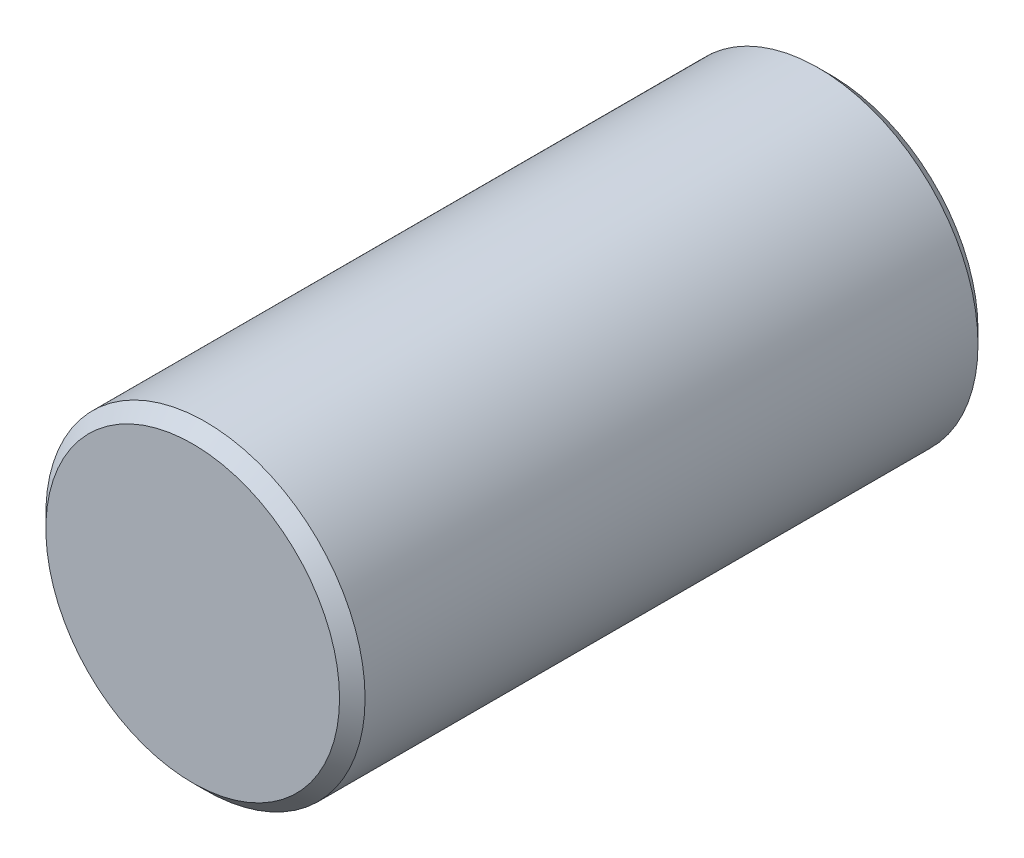
ISO-10303-21;
HEADER;
FILE_DESCRIPTION(('STEP AP214'),'2;1');
FILE_NAME('part.step','',(''),(''),'','','');
FILE_SCHEMA(('AUTOMOTIVE_DESIGN { 1 0 10303 214 1 1 1 1 }'));
ENDSEC;
DATA;
#1=APPLICATION_CONTEXT('core data for automotive mechanical design processes');
#2=APPLICATION_PROTOCOL_DEFINITION('international standard','automotive_design',2000,#1);
#3=PRODUCT_CONTEXT('',#1,'mechanical');
#4=PRODUCT('Part','Part','',(#3));
#5=PRODUCT_RELATED_PRODUCT_CATEGORY('part','',(#4));
#6=PRODUCT_DEFINITION_FORMATION('','',#4);
#7=PRODUCT_DEFINITION_CONTEXT('part definition',#1,'design');
#8=PRODUCT_DEFINITION('design','',#6,#7);
#9=PRODUCT_DEFINITION_SHAPE('','',#8);
#10=(LENGTH_UNIT() NAMED_UNIT(*) SI_UNIT(.MILLI.,.METRE.));
#11=(NAMED_UNIT(*) PLANE_ANGLE_UNIT() SI_UNIT($,.RADIAN.));
#12=(NAMED_UNIT(*) SI_UNIT($,.STERADIAN.) SOLID_ANGLE_UNIT());
#13=UNCERTAINTY_MEASURE_WITH_UNIT(LENGTH_MEASURE(1.E-05),#10,'distance_accuracy_value','');
#14=(GEOMETRIC_REPRESENTATION_CONTEXT(3) GLOBAL_UNCERTAINTY_ASSIGNED_CONTEXT((#13)) GLOBAL_UNIT_ASSIGNED_CONTEXT((#10,
#11,#12)) REPRESENTATION_CONTEXT('',''));
#15=CARTESIAN_POINT('',(0.,0.,0.));
#16=DIRECTION('',(0.,0.,1.));
#17=DIRECTION('',(1.,0.,0.));
#18=AXIS2_PLACEMENT_3D('',#15,#16,#17);
#19=CARTESIAN_POINT('',(0.,0.,107.5));
#20=DIRECTION('',(0.,0.,-1.));
#21=DIRECTION('',(-1.,0.,0.));
#22=AXIS2_PLACEMENT_3D('',#19,#20,#21);
#23=CYLINDRICAL_SURFACE('',#22,3.75);
#24=CARTESIAN_POINT('',(0.,0.,107.2));
#25=DIRECTION('',(0.,0.,1.));
#26=DIRECTION('',(1.,0.,0.));
#27=AXIS2_PLACEMENT_3D('',#24,#25,#26);
#28=CIRCLE('',#27,3.75);
#29=CARTESIAN_POINT('',(3.75,0.,107.2));
#30=VERTEX_POINT('',#29);
#31=EDGE_CURVE('E50',#30,#30,#28,.F.);
#32=ORIENTED_EDGE('',*,*,#31,.T.);
#33=EDGE_LOOP('',(#32));
#34=FACE_BOUND('',#33,.T.);
#35=CARTESIAN_POINT('',(0.,0.,92.8));
#36=DIRECTION('',(0.,0.,1.));
#37=DIRECTION('',(1.,0.,0.));
#38=AXIS2_PLACEMENT_3D('',#35,#36,#37);
#39=CIRCLE('',#38,3.75);
#40=CARTESIAN_POINT('',(3.75,0.,92.8));
#41=VERTEX_POINT('',#40);
#42=EDGE_CURVE('E55',#41,#41,#39,.T.);
#43=ORIENTED_EDGE('',*,*,#42,.T.);
#44=EDGE_LOOP('',(#43));
#45=FACE_BOUND('',#44,.T.);
#46=ADVANCED_FACE('F42',(#34,#45),#23,.T.);
#47=CARTESIAN_POINT('',(0.,0.,107.5));
#48=DIRECTION('',(0.,0.,1.));
#49=DIRECTION('',(1.,0.,0.));
#50=AXIS2_PLACEMENT_3D('',#47,#48,#49);
#51=PLANE('',#50);
#52=CARTESIAN_POINT('',(0.,0.,107.5));
#53=DIRECTION('',(0.,0.,1.));
#54=DIRECTION('',(1.,0.,0.));
#55=AXIS2_PLACEMENT_3D('',#52,#53,#54);
#56=CIRCLE('',#55,3.45);
#57=CARTESIAN_POINT('',(3.45,0.,107.5));
#58=VERTEX_POINT('',#57);
#59=EDGE_CURVE('E60',#58,#58,#56,.T.);
#60=ORIENTED_EDGE('',*,*,#59,.T.);
#61=EDGE_LOOP('',(#60));
#62=FACE_BOUND('',#61,.T.);
#63=ADVANCED_FACE('F67',(#62),#51,.T.);
#64=CARTESIAN_POINT('',(0.,0.,92.5));
#65=DIRECTION('',(0.,0.,1.));
#66=DIRECTION('',(1.,0.,0.));
#67=AXIS2_PLACEMENT_3D('',#64,#65,#66);
#68=PLANE('',#67);
#69=CARTESIAN_POINT('',(0.,0.,92.5));
#70=DIRECTION('',(0.,0.,1.));
#71=DIRECTION('',(1.,0.,0.));
#72=AXIS2_PLACEMENT_3D('',#69,#70,#71);
#73=CIRCLE('',#72,3.44999999999999);
#74=CARTESIAN_POINT('',(3.44999999999999,0.,92.5));
#75=VERTEX_POINT('',#74);
#76=EDGE_CURVE('E10',#75,#75,#73,.F.);
#77=ORIENTED_EDGE('',*,*,#76,.T.);
#78=EDGE_LOOP('',(#77));
#79=FACE_BOUND('',#78,.T.);
#80=ADVANCED_FACE('F71',(#79),#68,.F.);
#81=CARTESIAN_POINT('',(0.,0.,107.5));
#82=DIRECTION('',(0.,0.,-1.));
#83=DIRECTION('',(-1.,0.,0.));
#84=AXIS2_PLACEMENT_3D('',#81,#82,#83);
#85=CONICAL_SURFACE('',#84,3.45,0.785398163397447);
#86=ORIENTED_EDGE('',*,*,#31,.F.);
#87=EDGE_LOOP('',(#86));
#88=FACE_BOUND('',#87,.T.);
#89=ORIENTED_EDGE('',*,*,#59,.F.);
#90=EDGE_LOOP('',(#89));
#91=FACE_BOUND('',#90,.T.);
#92=ADVANCED_FACE('F69',(#88,#91),#85,.T.);
#93=CARTESIAN_POINT('',(0.,0.,92.8));
#94=DIRECTION('',(0.,0.,1.));
#95=DIRECTION('',(1.,0.,0.));
#96=AXIS2_PLACEMENT_3D('',#93,#94,#95);
#97=CONICAL_SURFACE('',#96,3.75,0.78539816339745);
#98=ORIENTED_EDGE('',*,*,#76,.F.);
#99=EDGE_LOOP('',(#98));
#100=FACE_BOUND('',#99,.T.);
#101=ORIENTED_EDGE('',*,*,#42,.F.);
#102=EDGE_LOOP('',(#101));
#103=FACE_BOUND('',#102,.T.);
#104=ADVANCED_FACE('F44',(#100,#103),#97,.T.);
#105=CLOSED_SHELL('',(#46,#63,#80,#92,#104));
#106=MANIFOLD_SOLID_BREP('B2',#105);
#107=ADVANCED_BREP_SHAPE_REPRESENTATION('',(#18,#106),#14);
#108=SHAPE_DEFINITION_REPRESENTATION(#9,#107);
ENDSEC;
END-ISO-10303-21;
